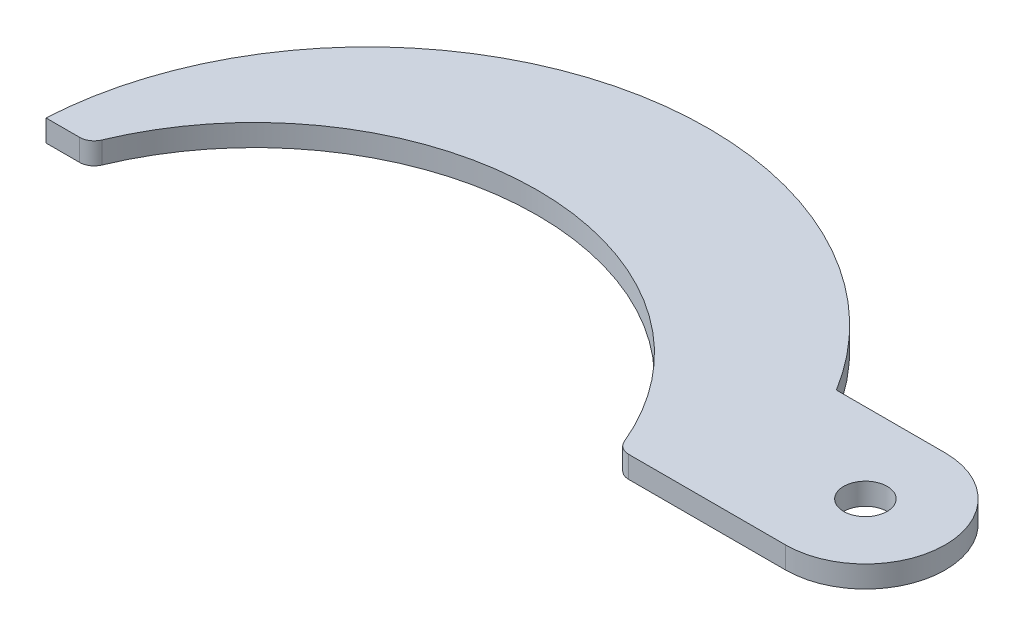
ISO-10303-21;
HEADER;
FILE_DESCRIPTION(('STEP AP214'),'2;1');
FILE_NAME('part.step','',(''),(''),'','','');
FILE_SCHEMA(('AUTOMOTIVE_DESIGN { 1 0 10303 214 1 1 1 1 }'));
ENDSEC;
DATA;
#1=APPLICATION_CONTEXT('core data for automotive mechanical design processes');
#2=APPLICATION_PROTOCOL_DEFINITION('international standard','automotive_design',2000,#1);
#3=PRODUCT_CONTEXT('',#1,'mechanical');
#4=PRODUCT('Part','Part','',(#3));
#5=PRODUCT_RELATED_PRODUCT_CATEGORY('part','',(#4));
#6=PRODUCT_DEFINITION_FORMATION('','',#4);
#7=PRODUCT_DEFINITION_CONTEXT('part definition',#1,'design');
#8=PRODUCT_DEFINITION('design','',#6,#7);
#9=PRODUCT_DEFINITION_SHAPE('','',#8);
#10=(LENGTH_UNIT() NAMED_UNIT(*) SI_UNIT(.MILLI.,.METRE.));
#11=(NAMED_UNIT(*) PLANE_ANGLE_UNIT() SI_UNIT($,.RADIAN.));
#12=(NAMED_UNIT(*) SI_UNIT($,.STERADIAN.) SOLID_ANGLE_UNIT());
#13=UNCERTAINTY_MEASURE_WITH_UNIT(LENGTH_MEASURE(1.E-05),#10,'distance_accuracy_value','');
#14=(GEOMETRIC_REPRESENTATION_CONTEXT(3) GLOBAL_UNCERTAINTY_ASSIGNED_CONTEXT((#13)) GLOBAL_UNIT_ASSIGNED_CONTEXT((#10,
#11,#12)) REPRESENTATION_CONTEXT('',''));
#15=CARTESIAN_POINT('',(0.,0.,0.));
#16=DIRECTION('',(0.,0.,1.));
#17=DIRECTION('',(1.,0.,0.));
#18=AXIS2_PLACEMENT_3D('',#15,#16,#17);
#19=CARTESIAN_POINT('',(23.4688537788103,3.,20.2049903960156));
#20=DIRECTION('',(0.,1.,0.));
#21=DIRECTION('',(0.,0.,1.));
#22=AXIS2_PLACEMENT_3D('',#19,#20,#21);
#23=PLANE('',#22);
#24=DIRECTION('',(1.,0.,0.));
#25=VECTOR('',#24,1.);
#26=CARTESIAN_POINT('',(-19.0311462211897,3.,6.46635873198148));
#27=LINE('',#26,#25);
#28=CARTESIAN_POINT('',(-19.0311462211897,3.,6.46635873198146));
#29=VERTEX_POINT('',#28);
#30=CARTESIAN_POINT('',(-14.3900351819591,3.,6.46635873198148));
#31=VERTEX_POINT('',#30);
#32=EDGE_CURVE('E142',#29,#31,#27,.T.);
#33=ORIENTED_EDGE('',*,*,#32,.T.);
#34=CARTESIAN_POINT('',(-14.3900351819591,3.,4.46635873198148));
#35=DIRECTION('',(0.,1.,0.));
#36=DIRECTION('',(0.,0.,1.));
#37=AXIS2_PLACEMENT_3D('',#34,#35,#36);
#38=CIRCLE('',#37,2.);
#39=CARTESIAN_POINT('',(-12.543260110702,3.,5.23409686193437));
#40=VERTEX_POINT('',#39);
#41=EDGE_CURVE('E11',#31,#40,#38,.T.);
#42=ORIENTED_EDGE('',*,*,#41,.T.);
#43=CARTESIAN_POINT('',(23.4688537788103,3.,20.2049903960156));
#44=DIRECTION('',(0.,-1.,0.));
#45=DIRECTION('',(0.,0.,1.));
#46=AXIS2_PLACEMENT_3D('',#43,#44,#45);
#47=CIRCLE('',#46,39.);
#48=CARTESIAN_POINT('',(59.4809676683226,3.,5.23409686193436));
#49=VERTEX_POINT('',#48);
#50=EDGE_CURVE('E116',#40,#49,#47,.T.);
#51=ORIENTED_EDGE('',*,*,#50,.T.);
#52=CARTESIAN_POINT('',(61.3277427395796,3.,4.46635873198148));
#53=DIRECTION('',(0.,1.,0.));
#54=DIRECTION('',(0.,0.,1.));
#55=AXIS2_PLACEMENT_3D('',#52,#53,#54);
#56=CIRCLE('',#55,2.);
#57=CARTESIAN_POINT('',(61.3277427395796,3.,6.46635873198148));
#58=VERTEX_POINT('',#57);
#59=EDGE_CURVE('E111',#49,#58,#56,.T.);
#60=ORIENTED_EDGE('',*,*,#59,.T.);
#61=DIRECTION('',(1.,0.,0.));
#62=VECTOR('',#61,1.);
#63=CARTESIAN_POINT('',(59.9688537788103,3.,6.46635873198148));
#64=LINE('',#63,#62);
#65=CARTESIAN_POINT('',(82.9688537788103,3.,6.46635873198148));
#66=VERTEX_POINT('',#65);
#67=EDGE_CURVE('E104',#58,#66,#64,.T.);
#68=ORIENTED_EDGE('',*,*,#67,.T.);
#69=CARTESIAN_POINT('',(82.9688537788103,3.,-4.53364126801852));
#70=DIRECTION('',(0.,1.,0.));
#71=DIRECTION('',(0.,0.,1.));
#72=AXIS2_PLACEMENT_3D('',#69,#70,#71);
#73=CIRCLE('',#72,11.);
#74=CARTESIAN_POINT('',(82.9688537788103,3.,-15.5336412680185));
#75=VERTEX_POINT('',#74);
#76=EDGE_CURVE('E108',#66,#75,#73,.T.);
#77=ORIENTED_EDGE('',*,*,#76,.T.);
#78=DIRECTION('',(-1.,0.,0.));
#79=VECTOR('',#78,1.);
#80=CARTESIAN_POINT('',(82.9688537788103,3.,-15.5336412680185));
#81=LINE('',#80,#79);
#82=CARTESIAN_POINT('',(67.9688537788103,3.,-15.5336412680185));
#83=VERTEX_POINT('',#82);
#84=EDGE_CURVE('E133',#75,#83,#81,.T.);
#85=ORIENTED_EDGE('',*,*,#84,.T.);
#86=CARTESIAN_POINT('',(27.8988584906668,3.,9.03046827432307));
#87=DIRECTION('',(0.,1.,0.));
#88=DIRECTION('',(0.,0.,1.));
#89=AXIS2_PLACEMENT_3D('',#86,#87,#88);
#90=CIRCLE('',#89,47.);
#91=EDGE_CURVE('E136',#83,#29,#90,.T.);
#92=ORIENTED_EDGE('',*,*,#91,.T.);
#93=EDGE_LOOP('',(#33,#42,#51,#60,#68,#77,#85,#92));
#94=FACE_BOUND('',#93,.T.);
#95=CARTESIAN_POINT('',(82.9688537788103,3.,-4.53364126801852));
#96=DIRECTION('',(0.,1.,0.));
#97=DIRECTION('',(0.,0.,1.));
#98=AXIS2_PLACEMENT_3D('',#95,#96,#97);
#99=CIRCLE('',#98,3.00000000000001);
#100=CARTESIAN_POINT('',(82.9688537788103,3.,-1.53364126801851));
#101=VERTEX_POINT('',#100);
#102=EDGE_CURVE('E149',#101,#101,#99,.T.);
#103=ORIENTED_EDGE('',*,*,#102,.F.);
#104=EDGE_LOOP('',(#103));
#105=FACE_BOUND('',#104,.T.);
#106=ADVANCED_FACE('F39',(#94,#105),#23,.T.);
#107=CARTESIAN_POINT('',(23.4688537788103,0.,20.2049903960156));
#108=DIRECTION('',(0.,1.,0.));
#109=DIRECTION('',(0.,0.,1.));
#110=AXIS2_PLACEMENT_3D('',#107,#108,#109);
#111=PLANE('',#110);
#112=CARTESIAN_POINT('',(23.4688537788103,0.,20.2049903960156));
#113=DIRECTION('',(0.,-1.,0.));
#114=DIRECTION('',(0.,0.,1.));
#115=AXIS2_PLACEMENT_3D('',#112,#113,#114);
#116=CIRCLE('',#115,39.);
#117=CARTESIAN_POINT('',(-12.543260110702,0.,5.23409686193437));
#118=VERTEX_POINT('',#117);
#119=CARTESIAN_POINT('',(59.4809676683226,0.,5.23409686193436));
#120=VERTEX_POINT('',#119);
#121=EDGE_CURVE('E146',#118,#120,#116,.T.);
#122=ORIENTED_EDGE('',*,*,#121,.F.);
#123=CARTESIAN_POINT('',(-14.3900351819591,0.,4.46635873198148));
#124=DIRECTION('',(0.,1.,0.));
#125=DIRECTION('',(0.,0.,1.));
#126=AXIS2_PLACEMENT_3D('',#123,#124,#125);
#127=CIRCLE('',#126,2.);
#128=CARTESIAN_POINT('',(-14.3900351819591,0.,6.46635873198148));
#129=VERTEX_POINT('',#128);
#130=EDGE_CURVE('E62',#118,#129,#127,.F.);
#131=ORIENTED_EDGE('',*,*,#130,.T.);
#132=DIRECTION('',(1.,0.,0.));
#133=VECTOR('',#132,1.);
#134=CARTESIAN_POINT('',(-19.0311462211897,0.,6.46635873198148));
#135=LINE('',#134,#133);
#136=CARTESIAN_POINT('',(-19.0311462211897,0.,6.46635873198146));
#137=VERTEX_POINT('',#136);
#138=EDGE_CURVE('E161',#137,#129,#135,.T.);
#139=ORIENTED_EDGE('',*,*,#138,.F.);
#140=CARTESIAN_POINT('',(27.8988584906668,0.,9.03046827432307));
#141=DIRECTION('',(0.,1.,0.));
#142=DIRECTION('',(0.,0.,1.));
#143=AXIS2_PLACEMENT_3D('',#140,#141,#142);
#144=CIRCLE('',#143,47.);
#145=CARTESIAN_POINT('',(67.9688537788103,0.,-15.5336412680185));
#146=VERTEX_POINT('',#145);
#147=EDGE_CURVE('E158',#146,#137,#144,.T.);
#148=ORIENTED_EDGE('',*,*,#147,.F.);
#149=DIRECTION('',(-1.,0.,0.));
#150=VECTOR('',#149,1.);
#151=CARTESIAN_POINT('',(82.9688537788103,0.,-15.5336412680185));
#152=LINE('',#151,#150);
#153=CARTESIAN_POINT('',(82.9688537788103,0.,-15.5336412680185));
#154=VERTEX_POINT('',#153);
#155=EDGE_CURVE('E155',#154,#146,#152,.T.);
#156=ORIENTED_EDGE('',*,*,#155,.F.);
#157=CARTESIAN_POINT('',(82.9688537788103,0.,-4.53364126801852));
#158=DIRECTION('',(0.,1.,0.));
#159=DIRECTION('',(0.,0.,1.));
#160=AXIS2_PLACEMENT_3D('',#157,#158,#159);
#161=CIRCLE('',#160,11.);
#162=CARTESIAN_POINT('',(82.9688537788103,0.,6.46635873198148));
#163=VERTEX_POINT('',#162);
#164=EDGE_CURVE('E152',#163,#154,#161,.T.);
#165=ORIENTED_EDGE('',*,*,#164,.F.);
#166=DIRECTION('',(1.,0.,0.));
#167=VECTOR('',#166,1.);
#168=CARTESIAN_POINT('',(59.9688537788103,0.,6.46635873198148));
#169=LINE('',#168,#167);
#170=CARTESIAN_POINT('',(61.3277427395796,0.,6.46635873198148));
#171=VERTEX_POINT('',#170);
#172=EDGE_CURVE('E122',#171,#163,#169,.T.);
#173=ORIENTED_EDGE('',*,*,#172,.F.);
#174=CARTESIAN_POINT('',(61.3277427395796,0.,4.46635873198148));
#175=DIRECTION('',(0.,1.,0.));
#176=DIRECTION('',(0.,0.,1.));
#177=AXIS2_PLACEMENT_3D('',#174,#175,#176);
#178=CIRCLE('',#177,2.);
#179=EDGE_CURVE('E175',#171,#120,#178,.F.);
#180=ORIENTED_EDGE('',*,*,#179,.T.);
#181=EDGE_LOOP('',(#122,#131,#139,#148,#156,#165,#173,#180));
#182=FACE_BOUND('',#181,.T.);
#183=CARTESIAN_POINT('',(82.9688537788103,0.,-4.53364126801852));
#184=DIRECTION('',(0.,1.,0.));
#185=DIRECTION('',(0.,0.,1.));
#186=AXIS2_PLACEMENT_3D('',#183,#184,#185);
#187=CIRCLE('',#186,3.00000000000001);
#188=CARTESIAN_POINT('',(82.9688537788103,0.,-1.53364126801851));
#189=VERTEX_POINT('',#188);
#190=EDGE_CURVE('E302',#189,#189,#187,.T.);
#191=ORIENTED_EDGE('',*,*,#190,.T.);
#192=EDGE_LOOP('',(#191));
#193=FACE_BOUND('',#192,.T.);
#194=ADVANCED_FACE('F197',(#182,#193),#111,.F.);
#195=CARTESIAN_POINT('',(23.4688537788103,3.,20.2049903960156));
#196=DIRECTION('',(0.,-1.,0.));
#197=DIRECTION('',(0.,0.,-1.));
#198=AXIS2_PLACEMENT_3D('',#195,#196,#197);
#199=CYLINDRICAL_SURFACE('',#198,39.);
#200=ORIENTED_EDGE('',*,*,#50,.F.);
#201=DIRECTION('',(0.,-1.,0.));
#202=VECTOR('',#201,1.);
#203=CARTESIAN_POINT('',(-12.543260110702,3.,5.23409686193436));
#204=LINE('',#203,#202);
#205=EDGE_CURVE('E185',#40,#118,#204,.T.);
#206=ORIENTED_EDGE('',*,*,#205,.T.);
#207=ORIENTED_EDGE('',*,*,#121,.T.);
#208=DIRECTION('',(0.,-1.,0.));
#209=VECTOR('',#208,1.);
#210=CARTESIAN_POINT('',(59.4809676683226,3.,5.23409686193436));
#211=LINE('',#210,#209);
#212=EDGE_CURVE('E179',#120,#49,#211,.F.);
#213=ORIENTED_EDGE('',*,*,#212,.T.);
#214=EDGE_LOOP('',(#200,#206,#207,#213));
#215=FACE_BOUND('',#214,.T.);
#216=ADVANCED_FACE('F194',(#215),#199,.F.);
#217=CARTESIAN_POINT('',(59.9688537788103,3.,6.46635873198148));
#218=DIRECTION('',(0.,0.,-1.));
#219=DIRECTION('',(-1.,0.,0.));
#220=AXIS2_PLACEMENT_3D('',#217,#218,#219);
#221=PLANE('',#220);
#222=ORIENTED_EDGE('',*,*,#67,.F.);
#223=DIRECTION('',(0.,-1.,0.));
#224=VECTOR('',#223,1.);
#225=CARTESIAN_POINT('',(61.3277427395796,3.,6.46635873198148));
#226=LINE('',#225,#224);
#227=EDGE_CURVE('E126',#58,#171,#226,.T.);
#228=ORIENTED_EDGE('',*,*,#227,.T.);
#229=ORIENTED_EDGE('',*,*,#172,.T.);
#230=DIRECTION('',(0.,-1.,0.));
#231=VECTOR('',#230,1.);
#232=CARTESIAN_POINT('',(82.9688537788103,3.,6.46635873198148));
#233=LINE('',#232,#231);
#234=EDGE_CURVE('E119',#66,#163,#233,.T.);
#235=ORIENTED_EDGE('',*,*,#234,.F.);
#236=EDGE_LOOP('',(#222,#228,#229,#235));
#237=FACE_BOUND('',#236,.T.);
#238=ADVANCED_FACE('F120',(#237),#221,.F.);
#239=CARTESIAN_POINT('',(82.9688537788103,3.,-4.53364126801852));
#240=DIRECTION('',(0.,-1.,0.));
#241=DIRECTION('',(0.,0.,-1.));
#242=AXIS2_PLACEMENT_3D('',#239,#240,#241);
#243=CYLINDRICAL_SURFACE('',#242,11.);
#244=ORIENTED_EDGE('',*,*,#164,.T.);
#245=DIRECTION('',(0.,-1.,0.));
#246=VECTOR('',#245,1.);
#247=CARTESIAN_POINT('',(82.9688537788103,3.,-15.5336412680185));
#248=LINE('',#247,#246);
#249=EDGE_CURVE('E127',#75,#154,#248,.T.);
#250=ORIENTED_EDGE('',*,*,#249,.F.);
#251=ORIENTED_EDGE('',*,*,#76,.F.);
#252=ORIENTED_EDGE('',*,*,#234,.T.);
#253=EDGE_LOOP('',(#244,#250,#251,#252));
#254=FACE_BOUND('',#253,.T.);
#255=ADVANCED_FACE('F129',(#254),#243,.T.);
#256=CARTESIAN_POINT('',(82.9688537788103,3.,-15.5336412680185));
#257=DIRECTION('',(0.,0.,1.));
#258=DIRECTION('',(1.,0.,0.));
#259=AXIS2_PLACEMENT_3D('',#256,#257,#258);
#260=PLANE('',#259);
#261=ORIENTED_EDGE('',*,*,#155,.T.);
#262=DIRECTION('',(0.,-1.,0.));
#263=VECTOR('',#262,1.);
#264=CARTESIAN_POINT('',(67.9688537788103,3.,-15.5336412680185));
#265=LINE('',#264,#263);
#266=EDGE_CURVE('E167',#83,#146,#265,.T.);
#267=ORIENTED_EDGE('',*,*,#266,.F.);
#268=ORIENTED_EDGE('',*,*,#84,.F.);
#269=ORIENTED_EDGE('',*,*,#249,.T.);
#270=EDGE_LOOP('',(#261,#267,#268,#269));
#271=FACE_BOUND('',#270,.T.);
#272=ADVANCED_FACE('F224',(#271),#260,.F.);
#273=CARTESIAN_POINT('',(27.8988584906668,3.,9.03046827432307));
#274=DIRECTION('',(0.,-1.,0.));
#275=DIRECTION('',(0.,0.,-1.));
#276=AXIS2_PLACEMENT_3D('',#273,#274,#275);
#277=CYLINDRICAL_SURFACE('',#276,47.);
#278=ORIENTED_EDGE('',*,*,#147,.T.);
#279=DIRECTION('',(0.,-1.,0.));
#280=VECTOR('',#279,1.);
#281=CARTESIAN_POINT('',(-19.0311462211897,3.,6.46635873198146));
#282=LINE('',#281,#280);
#283=EDGE_CURVE('E145',#29,#137,#282,.T.);
#284=ORIENTED_EDGE('',*,*,#283,.F.);
#285=ORIENTED_EDGE('',*,*,#91,.F.);
#286=ORIENTED_EDGE('',*,*,#266,.T.);
#287=EDGE_LOOP('',(#278,#284,#285,#286));
#288=FACE_BOUND('',#287,.T.);
#289=ADVANCED_FACE('F221',(#288),#277,.T.);
#290=CARTESIAN_POINT('',(-19.0311462211897,3.,6.46635873198148));
#291=DIRECTION('',(0.,0.,-1.));
#292=DIRECTION('',(-1.,0.,0.));
#293=AXIS2_PLACEMENT_3D('',#290,#291,#292);
#294=PLANE('',#293);
#295=ORIENTED_EDGE('',*,*,#138,.T.);
#296=DIRECTION('',(0.,-1.,0.));
#297=VECTOR('',#296,1.);
#298=CARTESIAN_POINT('',(-14.3900351819591,3.,6.46635873198148));
#299=LINE('',#298,#297);
#300=EDGE_CURVE('E48',#129,#31,#299,.F.);
#301=ORIENTED_EDGE('',*,*,#300,.T.);
#302=ORIENTED_EDGE('',*,*,#32,.F.);
#303=ORIENTED_EDGE('',*,*,#283,.T.);
#304=EDGE_LOOP('',(#295,#301,#302,#303));
#305=FACE_BOUND('',#304,.T.);
#306=ADVANCED_FACE('F208',(#305),#294,.F.);
#307=CARTESIAN_POINT('',(82.9688537788103,3.,-4.53364126801852));
#308=DIRECTION('',(0.,-1.,0.));
#309=DIRECTION('',(0.,0.,-1.));
#310=AXIS2_PLACEMENT_3D('',#307,#308,#309);
#311=CYLINDRICAL_SURFACE('',#310,3.00000000000001);
#312=ORIENTED_EDGE('',*,*,#102,.T.);
#313=EDGE_LOOP('',(#312));
#314=FACE_BOUND('',#313,.T.);
#315=ORIENTED_EDGE('',*,*,#190,.F.);
#316=EDGE_LOOP('',(#315));
#317=FACE_BOUND('',#316,.T.);
#318=ADVANCED_FACE('F203',(#314,#317),#311,.F.);
#319=CARTESIAN_POINT('',(61.3277427395796,3.,4.46635873198148));
#320=DIRECTION('',(0.,-1.,0.));
#321=DIRECTION('',(0.,0.,-1.));
#322=AXIS2_PLACEMENT_3D('',#319,#320,#321);
#323=CYLINDRICAL_SURFACE('',#322,2.);
#324=ORIENTED_EDGE('',*,*,#59,.F.);
#325=ORIENTED_EDGE('',*,*,#212,.F.);
#326=ORIENTED_EDGE('',*,*,#179,.F.);
#327=ORIENTED_EDGE('',*,*,#227,.F.);
#328=EDGE_LOOP('',(#324,#325,#326,#327));
#329=FACE_BOUND('',#328,.T.);
#330=ADVANCED_FACE('F201',(#329),#323,.T.);
#331=CARTESIAN_POINT('',(-14.3900351819591,3.,4.46635873198148));
#332=DIRECTION('',(0.,-1.,0.));
#333=DIRECTION('',(0.,0.,-1.));
#334=AXIS2_PLACEMENT_3D('',#331,#332,#333);
#335=CYLINDRICAL_SURFACE('',#334,2.);
#336=ORIENTED_EDGE('',*,*,#41,.F.);
#337=ORIENTED_EDGE('',*,*,#300,.F.);
#338=ORIENTED_EDGE('',*,*,#130,.F.);
#339=ORIENTED_EDGE('',*,*,#205,.F.);
#340=EDGE_LOOP('',(#336,#337,#338,#339));
#341=FACE_BOUND('',#340,.T.);
#342=ADVANCED_FACE('F41',(#341),#335,.T.);
#343=CLOSED_SHELL('',(#106,#194,#216,#238,#255,#272,#289,#306,#318,#330,#342));
#344=MANIFOLD_SOLID_BREP('B2',#343);
#345=ADVANCED_BREP_SHAPE_REPRESENTATION('',(#18,#344),#14);
#346=SHAPE_DEFINITION_REPRESENTATION(#9,#345);
ENDSEC;
END-ISO-10303-21;
